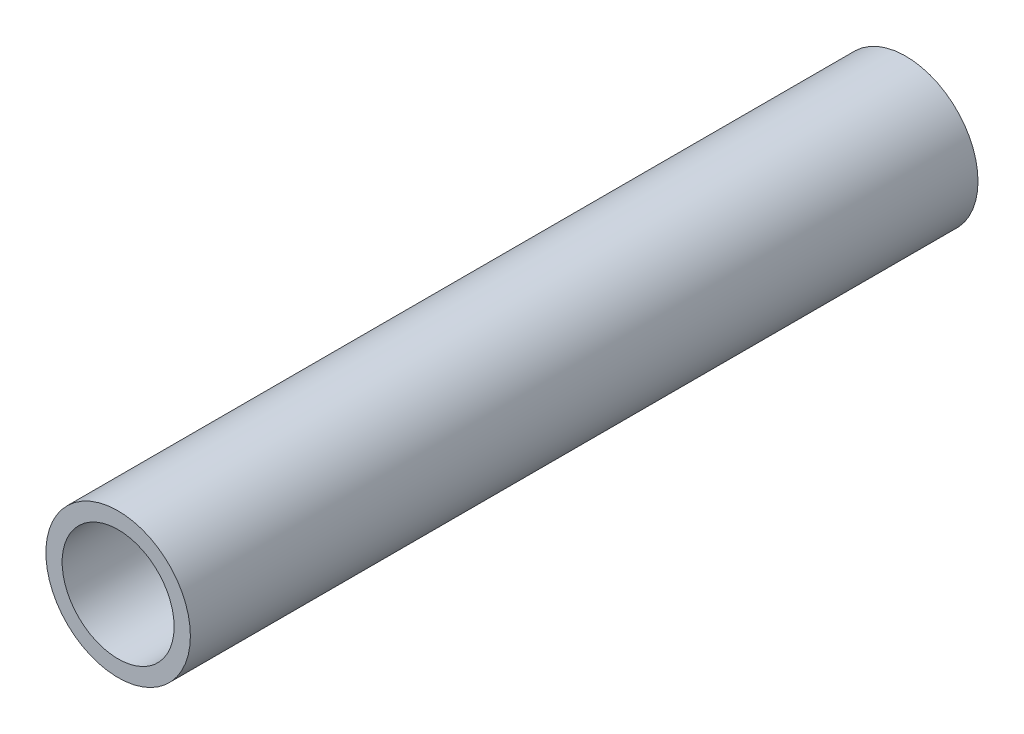
ISO-10303-21;
HEADER;
FILE_DESCRIPTION(('STEP AP214'),'2;1');
FILE_NAME('part.step','',(''),(''),'','','');
FILE_SCHEMA(('AUTOMOTIVE_DESIGN { 1 0 10303 214 1 1 1 1 }'));
ENDSEC;
DATA;
#1=APPLICATION_CONTEXT('core data for automotive mechanical design processes');
#2=APPLICATION_PROTOCOL_DEFINITION('international standard','automotive_design',2000,#1);
#3=PRODUCT_CONTEXT('',#1,'mechanical');
#4=PRODUCT('Part','Part','',(#3));
#5=PRODUCT_RELATED_PRODUCT_CATEGORY('part','',(#4));
#6=PRODUCT_DEFINITION_FORMATION('','',#4);
#7=PRODUCT_DEFINITION_CONTEXT('part definition',#1,'design');
#8=PRODUCT_DEFINITION('design','',#6,#7);
#9=PRODUCT_DEFINITION_SHAPE('','',#8);
#10=(LENGTH_UNIT() NAMED_UNIT(*) SI_UNIT(.MILLI.,.METRE.));
#11=(NAMED_UNIT(*) PLANE_ANGLE_UNIT() SI_UNIT($,.RADIAN.));
#12=(NAMED_UNIT(*) SI_UNIT($,.STERADIAN.) SOLID_ANGLE_UNIT());
#13=UNCERTAINTY_MEASURE_WITH_UNIT(LENGTH_MEASURE(1.E-05),#10,'distance_accuracy_value','');
#14=(GEOMETRIC_REPRESENTATION_CONTEXT(3) GLOBAL_UNCERTAINTY_ASSIGNED_CONTEXT((#13)) GLOBAL_UNIT_ASSIGNED_CONTEXT((#10,
#11,#12)) REPRESENTATION_CONTEXT('',''));
#15=CARTESIAN_POINT('',(0.,0.,0.));
#16=DIRECTION('',(0.,0.,1.));
#17=DIRECTION('',(1.,0.,0.));
#18=AXIS2_PLACEMENT_3D('',#15,#16,#17);
#19=CARTESIAN_POINT('',(0.,0.,10.9));
#20=DIRECTION('',(0.,0.,1.));
#21=DIRECTION('',(1.,0.,0.));
#22=AXIS2_PLACEMENT_3D('',#19,#20,#21);
#23=PLANE('',#22);
#24=CARTESIAN_POINT('',(0.,0.,10.9));
#25=DIRECTION('',(0.,0.,1.));
#26=DIRECTION('',(1.,0.,0.));
#27=AXIS2_PLACEMENT_3D('',#24,#25,#26);
#28=CIRCLE('',#27,1.);
#29=CARTESIAN_POINT('',(1.,0.,10.9));
#30=VERTEX_POINT('',#29);
#31=EDGE_CURVE('E10',#30,#30,#28,.T.);
#32=ORIENTED_EDGE('',*,*,#31,.T.);
#33=EDGE_LOOP('',(#32));
#34=FACE_BOUND('',#33,.T.);
#35=CARTESIAN_POINT('',(0.,0.,10.9));
#36=DIRECTION('',(0.,0.,1.));
#37=DIRECTION('',(1.,0.,0.));
#38=AXIS2_PLACEMENT_3D('',#35,#36,#37);
#39=CIRCLE('',#38,0.775);
#40=CARTESIAN_POINT('',(0.775,0.,10.9));
#41=VERTEX_POINT('',#40);
#42=EDGE_CURVE('E46',#41,#41,#39,.T.);
#43=ORIENTED_EDGE('',*,*,#42,.F.);
#44=EDGE_LOOP('',(#43));
#45=FACE_BOUND('',#44,.T.);
#46=ADVANCED_FACE('F35',(#34,#45),#23,.T.);
#47=CARTESIAN_POINT('',(0.,0.,0.));
#48=DIRECTION('',(0.,0.,1.));
#49=DIRECTION('',(1.,0.,0.));
#50=AXIS2_PLACEMENT_3D('',#47,#48,#49);
#51=PLANE('',#50);
#52=CARTESIAN_POINT('',(0.,0.,0.));
#53=DIRECTION('',(0.,0.,1.));
#54=DIRECTION('',(1.,0.,0.));
#55=AXIS2_PLACEMENT_3D('',#52,#53,#54);
#56=CIRCLE('',#55,1.);
#57=CARTESIAN_POINT('',(1.,0.,0.));
#58=VERTEX_POINT('',#57);
#59=EDGE_CURVE('E39',#58,#58,#56,.T.);
#60=ORIENTED_EDGE('',*,*,#59,.F.);
#61=EDGE_LOOP('',(#60));
#62=FACE_BOUND('',#61,.T.);
#63=CARTESIAN_POINT('',(0.,0.,0.));
#64=DIRECTION('',(0.,0.,1.));
#65=DIRECTION('',(1.,0.,0.));
#66=AXIS2_PLACEMENT_3D('',#63,#64,#65);
#67=CIRCLE('',#66,0.775);
#68=CARTESIAN_POINT('',(0.775,0.,0.));
#69=VERTEX_POINT('',#68);
#70=EDGE_CURVE('E48',#69,#69,#67,.T.);
#71=ORIENTED_EDGE('',*,*,#70,.T.);
#72=EDGE_LOOP('',(#71));
#73=FACE_BOUND('',#72,.T.);
#74=ADVANCED_FACE('F58',(#62,#73),#51,.F.);
#75=CARTESIAN_POINT('',(0.,0.,10.9));
#76=DIRECTION('',(0.,0.,-1.));
#77=DIRECTION('',(-1.,0.,0.));
#78=AXIS2_PLACEMENT_3D('',#75,#76,#77);
#79=CYLINDRICAL_SURFACE('',#78,1.);
#80=ORIENTED_EDGE('',*,*,#31,.F.);
#81=EDGE_LOOP('',(#80));
#82=FACE_BOUND('',#81,.T.);
#83=ORIENTED_EDGE('',*,*,#59,.T.);
#84=EDGE_LOOP('',(#83));
#85=FACE_BOUND('',#84,.T.);
#86=ADVANCED_FACE('F37',(#82,#85),#79,.T.);
#87=CARTESIAN_POINT('',(0.,0.,10.9));
#88=DIRECTION('',(0.,0.,-1.));
#89=DIRECTION('',(-1.,0.,0.));
#90=AXIS2_PLACEMENT_3D('',#87,#88,#89);
#91=CYLINDRICAL_SURFACE('',#90,0.775);
#92=ORIENTED_EDGE('',*,*,#42,.T.);
#93=EDGE_LOOP('',(#92));
#94=FACE_BOUND('',#93,.T.);
#95=ORIENTED_EDGE('',*,*,#70,.F.);
#96=EDGE_LOOP('',(#95));
#97=FACE_BOUND('',#96,.T.);
#98=ADVANCED_FACE('F54',(#94,#97),#91,.F.);
#99=CLOSED_SHELL('',(#46,#74,#86,#98));
#100=MANIFOLD_SOLID_BREP('B2',#99);
#101=ADVANCED_BREP_SHAPE_REPRESENTATION('',(#18,#100),#14);
#102=SHAPE_DEFINITION_REPRESENTATION(#9,#101);
ENDSEC;
END-ISO-10303-21;
